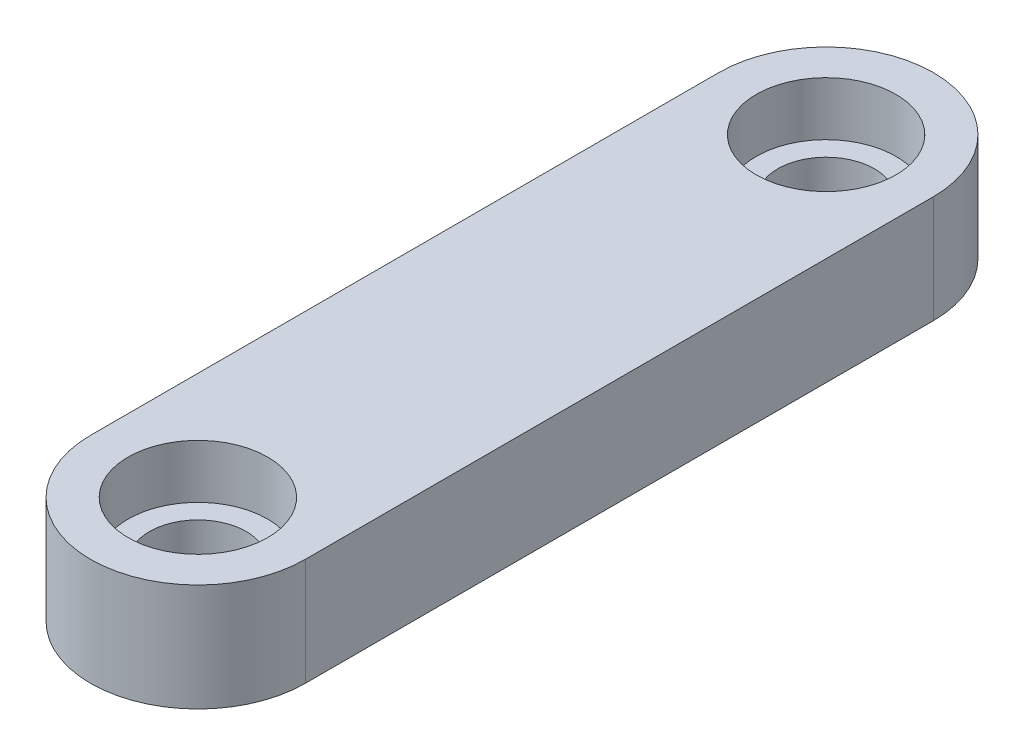
ISO-10303-21;
HEADER;
FILE_DESCRIPTION(('STEP AP214'),'2;1');
FILE_NAME('part.step','',(''),(''),'','','');
FILE_SCHEMA(('AUTOMOTIVE_DESIGN { 1 0 10303 214 1 1 1 1 }'));
ENDSEC;
DATA;
#1=APPLICATION_CONTEXT('core data for automotive mechanical design processes');
#2=APPLICATION_PROTOCOL_DEFINITION('international standard','automotive_design',2000,#1);
#3=PRODUCT_CONTEXT('',#1,'mechanical');
#4=PRODUCT('Part','Part','',(#3));
#5=PRODUCT_RELATED_PRODUCT_CATEGORY('part','',(#4));
#6=PRODUCT_DEFINITION_FORMATION('','',#4);
#7=PRODUCT_DEFINITION_CONTEXT('part definition',#1,'design');
#8=PRODUCT_DEFINITION('design','',#6,#7);
#9=PRODUCT_DEFINITION_SHAPE('','',#8);
#10=(LENGTH_UNIT() NAMED_UNIT(*) SI_UNIT(.MILLI.,.METRE.));
#11=(NAMED_UNIT(*) PLANE_ANGLE_UNIT() SI_UNIT($,.RADIAN.));
#12=(NAMED_UNIT(*) SI_UNIT($,.STERADIAN.) SOLID_ANGLE_UNIT());
#13=UNCERTAINTY_MEASURE_WITH_UNIT(LENGTH_MEASURE(1.E-05),#10,'distance_accuracy_value','');
#14=(GEOMETRIC_REPRESENTATION_CONTEXT(3) GLOBAL_UNCERTAINTY_ASSIGNED_CONTEXT((#13)) GLOBAL_UNIT_ASSIGNED_CONTEXT((#10,
#11,#12)) REPRESENTATION_CONTEXT('',''));
#15=CARTESIAN_POINT('',(0.,0.,0.));
#16=DIRECTION('',(0.,0.,1.));
#17=DIRECTION('',(1.,0.,0.));
#18=AXIS2_PLACEMENT_3D('',#15,#16,#17);
#19=CARTESIAN_POINT('',(-10.,5.,80.297387422123));
#20=DIRECTION('',(0.,-1.,0.));
#21=DIRECTION('',(0.,0.,-1.));
#22=AXIS2_PLACEMENT_3D('',#19,#20,#21);
#23=PLANE('',#22);
#24=CARTESIAN_POINT('',(0.,5.,10.9027061529883));
#25=DIRECTION('',(0.,1.,0.));
#26=DIRECTION('',(0.,0.,1.));
#27=AXIS2_PLACEMENT_3D('',#24,#25,#26);
#28=CIRCLE('',#27,6.5);
#29=CARTESIAN_POINT('',(0.,5.,17.4027061529883));
#30=VERTEX_POINT('',#29);
#31=EDGE_CURVE('E147',#30,#30,#28,.T.);
#32=ORIENTED_EDGE('',*,*,#31,.F.);
#33=EDGE_LOOP('',(#32));
#34=FACE_BOUND('',#33,.T.);
#35=CARTESIAN_POINT('',(0.,5.,69.3946812691347));
#36=DIRECTION('',(0.,-1.,0.));
#37=DIRECTION('',(0.,0.,-1.));
#38=AXIS2_PLACEMENT_3D('',#35,#36,#37);
#39=CIRCLE('',#38,6.5);
#40=CARTESIAN_POINT('',(0.,5.,62.8946812691347));
#41=VERTEX_POINT('',#40);
#42=EDGE_CURVE('E126',#41,#41,#39,.T.);
#43=ORIENTED_EDGE('',*,*,#42,.T.);
#44=EDGE_LOOP('',(#43));
#45=FACE_BOUND('',#44,.T.);
#46=CARTESIAN_POINT('',(0.,5.,69.3946812691347));
#47=DIRECTION('',(0.,1.,0.));
#48=DIRECTION('',(0.,0.,-1.));
#49=AXIS2_PLACEMENT_3D('',#46,#47,#48);
#50=CIRCLE('',#49,10.);
#51=CARTESIAN_POINT('',(-10.,5.,69.3946812691347));
#52=VERTEX_POINT('',#51);
#53=CARTESIAN_POINT('',(10.,5.,69.3946812691347));
#54=VERTEX_POINT('',#53);
#55=EDGE_CURVE('E80',#52,#54,#50,.T.);
#56=ORIENTED_EDGE('',*,*,#55,.T.);
#57=DIRECTION('',(0.,0.,-1.));
#58=VECTOR('',#57,1.);
#59=CARTESIAN_POINT('',(10.,5.,80.297387422123));
#60=LINE('',#59,#58);
#61=CARTESIAN_POINT('',(10.,5.,10.9027061529883));
#62=VERTEX_POINT('',#61);
#63=EDGE_CURVE('E101',#54,#62,#60,.T.);
#64=ORIENTED_EDGE('',*,*,#63,.T.);
#65=CARTESIAN_POINT('',(0.,5.,10.9027061529883));
#66=DIRECTION('',(0.,-1.,0.));
#67=DIRECTION('',(0.,0.,1.));
#68=AXIS2_PLACEMENT_3D('',#65,#66,#67);
#69=CIRCLE('',#68,10.);
#70=CARTESIAN_POINT('',(-10.,5.,10.9027061529883));
#71=VERTEX_POINT('',#70);
#72=EDGE_CURVE('E99',#71,#62,#69,.T.);
#73=ORIENTED_EDGE('',*,*,#72,.F.);
#74=DIRECTION('',(0.,0.,-1.));
#75=VECTOR('',#74,1.);
#76=CARTESIAN_POINT('',(-10.,5.,80.297387422123));
#77=LINE('',#76,#75);
#78=EDGE_CURVE('E92',#52,#71,#77,.T.);
#79=ORIENTED_EDGE('',*,*,#78,.F.);
#80=EDGE_LOOP('',(#56,#64,#73,#79));
#81=FACE_BOUND('',#80,.T.);
#82=ADVANCED_FACE('F39',(#34,#45,#81),#23,.F.);
#83=CARTESIAN_POINT('',(10.,-5.,80.297387422123));
#84=DIRECTION('',(-1.,0.,0.));
#85=DIRECTION('',(0.,0.,1.));
#86=AXIS2_PLACEMENT_3D('',#83,#84,#85);
#87=PLANE('',#86);
#88=DIRECTION('',(0.,1.,0.));
#89=VECTOR('',#88,1.);
#90=CARTESIAN_POINT('',(10.,-15.,69.3946812691347));
#91=LINE('',#90,#89);
#92=CARTESIAN_POINT('',(10.,-5.,69.3946812691347));
#93=VERTEX_POINT('',#92);
#94=EDGE_CURVE('E82',#93,#54,#91,.T.);
#95=ORIENTED_EDGE('',*,*,#94,.F.);
#96=DIRECTION('',(0.,0.,-1.));
#97=VECTOR('',#96,1.);
#98=CARTESIAN_POINT('',(10.,-5.,80.297387422123));
#99=LINE('',#98,#97);
#100=CARTESIAN_POINT('',(10.,-5.,10.9027061529883));
#101=VERTEX_POINT('',#100);
#102=EDGE_CURVE('E62',#93,#101,#99,.T.);
#103=ORIENTED_EDGE('',*,*,#102,.T.);
#104=DIRECTION('',(0.,1.,0.));
#105=VECTOR('',#104,1.);
#106=CARTESIAN_POINT('',(10.,-15.,10.9027061529883));
#107=LINE('',#106,#105);
#108=EDGE_CURVE('E139',#101,#62,#107,.T.);
#109=ORIENTED_EDGE('',*,*,#108,.T.);
#110=ORIENTED_EDGE('',*,*,#63,.F.);
#111=EDGE_LOOP('',(#95,#103,#109,#110));
#112=FACE_BOUND('',#111,.T.);
#113=ADVANCED_FACE('F41',(#112),#87,.F.);
#114=CARTESIAN_POINT('',(-10.,-5.,80.297387422123));
#115=DIRECTION('',(1.,0.,0.));
#116=DIRECTION('',(0.,0.,-1.));
#117=AXIS2_PLACEMENT_3D('',#114,#115,#116);
#118=PLANE('',#117);
#119=DIRECTION('',(0.,1.,0.));
#120=VECTOR('',#119,1.);
#121=CARTESIAN_POINT('',(-10.,-15.,69.3946812691347));
#122=LINE('',#121,#120);
#123=CARTESIAN_POINT('',(-10.,-5.,69.3946812691347));
#124=VERTEX_POINT('',#123);
#125=EDGE_CURVE('E54',#124,#52,#122,.T.);
#126=ORIENTED_EDGE('',*,*,#125,.T.);
#127=ORIENTED_EDGE('',*,*,#78,.T.);
#128=DIRECTION('',(0.,1.,0.));
#129=VECTOR('',#128,1.);
#130=CARTESIAN_POINT('',(-10.,-15.,10.9027061529883));
#131=LINE('',#130,#129);
#132=CARTESIAN_POINT('',(-10.,-5.,10.9027061529883));
#133=VERTEX_POINT('',#132);
#134=EDGE_CURVE('E114',#133,#71,#131,.T.);
#135=ORIENTED_EDGE('',*,*,#134,.F.);
#136=DIRECTION('',(0.,0.,-1.));
#137=VECTOR('',#136,1.);
#138=CARTESIAN_POINT('',(-10.,-5.,80.297387422123));
#139=LINE('',#138,#137);
#140=EDGE_CURVE('E94',#124,#133,#139,.T.);
#141=ORIENTED_EDGE('',*,*,#140,.F.);
#142=EDGE_LOOP('',(#126,#127,#135,#141));
#143=FACE_BOUND('',#142,.T.);
#144=ADVANCED_FACE('F90',(#143),#118,.F.);
#145=CARTESIAN_POINT('',(-10.,-5.,80.297387422123));
#146=DIRECTION('',(0.,1.,0.));
#147=DIRECTION('',(0.,0.,1.));
#148=AXIS2_PLACEMENT_3D('',#145,#146,#147);
#149=PLANE('',#148);
#150=CARTESIAN_POINT('',(0.,-5.,69.3946812691347));
#151=DIRECTION('',(0.,1.,0.));
#152=DIRECTION('',(0.,0.,1.));
#153=AXIS2_PLACEMENT_3D('',#150,#151,#152);
#154=CIRCLE('',#153,10.);
#155=EDGE_CURVE('E11',#124,#93,#154,.T.);
#156=ORIENTED_EDGE('',*,*,#155,.F.);
#157=ORIENTED_EDGE('',*,*,#140,.T.);
#158=CARTESIAN_POINT('',(0.,-5.,10.9027061529883));
#159=DIRECTION('',(0.,1.,0.));
#160=DIRECTION('',(0.,0.,1.));
#161=AXIS2_PLACEMENT_3D('',#158,#159,#160);
#162=CIRCLE('',#161,10.);
#163=EDGE_CURVE('E48',#133,#101,#162,.F.);
#164=ORIENTED_EDGE('',*,*,#163,.T.);
#165=ORIENTED_EDGE('',*,*,#102,.F.);
#166=EDGE_LOOP('',(#156,#157,#164,#165));
#167=FACE_BOUND('',#166,.T.);
#168=CARTESIAN_POINT('',(0.,-5.,69.3946812691347));
#169=DIRECTION('',(0.,1.,0.));
#170=DIRECTION('',(0.,0.,1.));
#171=AXIS2_PLACEMENT_3D('',#168,#169,#170);
#172=CIRCLE('',#171,4.5);
#173=CARTESIAN_POINT('',(0.,-5.,73.8946812691347));
#174=VERTEX_POINT('',#173);
#175=EDGE_CURVE('E120',#174,#174,#172,.F.);
#176=ORIENTED_EDGE('',*,*,#175,.F.);
#177=EDGE_LOOP('',(#176));
#178=FACE_BOUND('',#177,.T.);
#179=CARTESIAN_POINT('',(0.,-5.,10.9027061529883));
#180=DIRECTION('',(0.,1.,0.));
#181=DIRECTION('',(0.,0.,1.));
#182=AXIS2_PLACEMENT_3D('',#179,#180,#181);
#183=CIRCLE('',#182,4.5);
#184=CARTESIAN_POINT('',(0.,-5.,15.4027061529883));
#185=VERTEX_POINT('',#184);
#186=EDGE_CURVE('E113',#185,#185,#183,.T.);
#187=ORIENTED_EDGE('',*,*,#186,.T.);
#188=EDGE_LOOP('',(#187));
#189=FACE_BOUND('',#188,.T.);
#190=ADVANCED_FACE('F189',(#167,#178,#189),#149,.F.);
#191=CARTESIAN_POINT('',(0.,0.,10.9027061529883));
#192=DIRECTION('',(0.,1.,0.));
#193=DIRECTION('',(0.,0.,1.));
#194=AXIS2_PLACEMENT_3D('',#191,#192,#193);
#195=CYLINDRICAL_SURFACE('',#194,6.5);
#196=CARTESIAN_POINT('',(0.,0.,10.9027061529883));
#197=DIRECTION('',(0.,1.,0.));
#198=DIRECTION('',(0.,0.,1.));
#199=AXIS2_PLACEMENT_3D('',#196,#197,#198);
#200=CIRCLE('',#199,6.5);
#201=CARTESIAN_POINT('',(0.,0.,17.4027061529883));
#202=VERTEX_POINT('',#201);
#203=EDGE_CURVE('E148',#202,#202,#200,.T.);
#204=ORIENTED_EDGE('',*,*,#203,.F.);
#205=EDGE_LOOP('',(#204));
#206=FACE_BOUND('',#205,.T.);
#207=ORIENTED_EDGE('',*,*,#31,.T.);
#208=EDGE_LOOP('',(#207));
#209=FACE_BOUND('',#208,.T.);
#210=ADVANCED_FACE('F157',(#206,#209),#195,.F.);
#211=CARTESIAN_POINT('',(0.,0.,10.9027061529883));
#212=DIRECTION('',(0.,1.,0.));
#213=DIRECTION('',(0.,0.,1.));
#214=AXIS2_PLACEMENT_3D('',#211,#212,#213);
#215=PLANE('',#214);
#216=CARTESIAN_POINT('',(0.,0.,10.9027061529883));
#217=DIRECTION('',(0.,1.,0.));
#218=DIRECTION('',(0.,0.,1.));
#219=AXIS2_PLACEMENT_3D('',#216,#217,#218);
#220=CIRCLE('',#219,4.5);
#221=CARTESIAN_POINT('',(0.,0.,15.4027061529883));
#222=VERTEX_POINT('',#221);
#223=EDGE_CURVE('E109',#222,#222,#220,.T.);
#224=ORIENTED_EDGE('',*,*,#223,.F.);
#225=EDGE_LOOP('',(#224));
#226=FACE_BOUND('',#225,.T.);
#227=ORIENTED_EDGE('',*,*,#203,.T.);
#228=EDGE_LOOP('',(#227));
#229=FACE_BOUND('',#228,.T.);
#230=ADVANCED_FACE('F182',(#226,#229),#215,.T.);
#231=CARTESIAN_POINT('',(0.,-15.,10.9027061529883));
#232=DIRECTION('',(0.,1.,0.));
#233=DIRECTION('',(0.,0.,1.));
#234=AXIS2_PLACEMENT_3D('',#231,#232,#233);
#235=CYLINDRICAL_SURFACE('',#234,4.5);
#236=ORIENTED_EDGE('',*,*,#223,.T.);
#237=EDGE_LOOP('',(#236));
#238=FACE_BOUND('',#237,.T.);
#239=ORIENTED_EDGE('',*,*,#186,.F.);
#240=EDGE_LOOP('',(#239));
#241=FACE_BOUND('',#240,.T.);
#242=ADVANCED_FACE('F175',(#238,#241),#235,.F.);
#243=CARTESIAN_POINT('',(0.,-15.,10.9027061529883));
#244=DIRECTION('',(0.,1.,0.));
#245=DIRECTION('',(0.,0.,1.));
#246=AXIS2_PLACEMENT_3D('',#243,#244,#245);
#247=CYLINDRICAL_SURFACE('',#246,10.);
#248=ORIENTED_EDGE('',*,*,#134,.T.);
#249=ORIENTED_EDGE('',*,*,#72,.T.);
#250=ORIENTED_EDGE('',*,*,#108,.F.);
#251=ORIENTED_EDGE('',*,*,#163,.F.);
#252=EDGE_LOOP('',(#248,#249,#250,#251));
#253=FACE_BOUND('',#252,.T.);
#254=ADVANCED_FACE('F166',(#253),#247,.T.);
#255=CARTESIAN_POINT('',(0.,0.,69.3946812691347));
#256=DIRECTION('',(0.,1.,0.));
#257=DIRECTION('',(0.,0.,1.));
#258=AXIS2_PLACEMENT_3D('',#255,#256,#257);
#259=CYLINDRICAL_SURFACE('',#258,6.5);
#260=CARTESIAN_POINT('',(0.,0.,69.3946812691347));
#261=DIRECTION('',(0.,-1.,0.));
#262=DIRECTION('',(0.,0.,-1.));
#263=AXIS2_PLACEMENT_3D('',#260,#261,#262);
#264=CIRCLE('',#263,6.5);
#265=CARTESIAN_POINT('',(0.,0.,62.8946812691347));
#266=VERTEX_POINT('',#265);
#267=EDGE_CURVE('E130',#266,#266,#264,.T.);
#268=ORIENTED_EDGE('',*,*,#267,.T.);
#269=EDGE_LOOP('',(#268));
#270=FACE_BOUND('',#269,.T.);
#271=ORIENTED_EDGE('',*,*,#42,.F.);
#272=EDGE_LOOP('',(#271));
#273=FACE_BOUND('',#272,.T.);
#274=ADVANCED_FACE('F163',(#270,#273),#259,.F.);
#275=CARTESIAN_POINT('',(0.,0.,69.3946812691347));
#276=DIRECTION('',(0.,1.,0.));
#277=DIRECTION('',(0.,0.,-1.));
#278=AXIS2_PLACEMENT_3D('',#275,#276,#277);
#279=PLANE('',#278);
#280=CARTESIAN_POINT('',(0.,0.,69.3946812691347));
#281=DIRECTION('',(0.,1.,0.));
#282=DIRECTION('',(0.,0.,1.));
#283=AXIS2_PLACEMENT_3D('',#280,#281,#282);
#284=CIRCLE('',#283,4.5);
#285=CARTESIAN_POINT('',(0.,0.,73.8946812691347));
#286=VERTEX_POINT('',#285);
#287=EDGE_CURVE('E117',#286,#286,#284,.F.);
#288=ORIENTED_EDGE('',*,*,#287,.T.);
#289=EDGE_LOOP('',(#288));
#290=FACE_BOUND('',#289,.T.);
#291=ORIENTED_EDGE('',*,*,#267,.F.);
#292=EDGE_LOOP('',(#291));
#293=FACE_BOUND('',#292,.T.);
#294=ADVANCED_FACE('F165',(#290,#293),#279,.T.);
#295=CARTESIAN_POINT('',(0.,-15.,69.3946812691347));
#296=DIRECTION('',(0.,1.,0.));
#297=DIRECTION('',(0.,0.,1.));
#298=AXIS2_PLACEMENT_3D('',#295,#296,#297);
#299=CYLINDRICAL_SURFACE('',#298,4.5);
#300=ORIENTED_EDGE('',*,*,#287,.F.);
#301=EDGE_LOOP('',(#300));
#302=FACE_BOUND('',#301,.T.);
#303=ORIENTED_EDGE('',*,*,#175,.T.);
#304=EDGE_LOOP('',(#303));
#305=FACE_BOUND('',#304,.T.);
#306=ADVANCED_FACE('F173',(#302,#305),#299,.F.);
#307=CARTESIAN_POINT('',(0.,-15.,69.3946812691347));
#308=DIRECTION('',(0.,1.,0.));
#309=DIRECTION('',(0.,0.,1.));
#310=AXIS2_PLACEMENT_3D('',#307,#308,#309);
#311=CYLINDRICAL_SURFACE('',#310,10.);
#312=ORIENTED_EDGE('',*,*,#155,.T.);
#313=ORIENTED_EDGE('',*,*,#94,.T.);
#314=ORIENTED_EDGE('',*,*,#55,.F.);
#315=ORIENTED_EDGE('',*,*,#125,.F.);
#316=EDGE_LOOP('',(#312,#313,#314,#315));
#317=FACE_BOUND('',#316,.T.);
#318=ADVANCED_FACE('F81',(#317),#311,.T.);
#319=CLOSED_SHELL('',(#82,#113,#144,#190,#210,#230,#242,#254,#274,#294,#306,#318));
#320=MANIFOLD_SOLID_BREP('B2',#319);
#321=ADVANCED_BREP_SHAPE_REPRESENTATION('',(#18,#320),#14);
#322=SHAPE_DEFINITION_REPRESENTATION(#9,#321);
ENDSEC;
END-ISO-10303-21;
